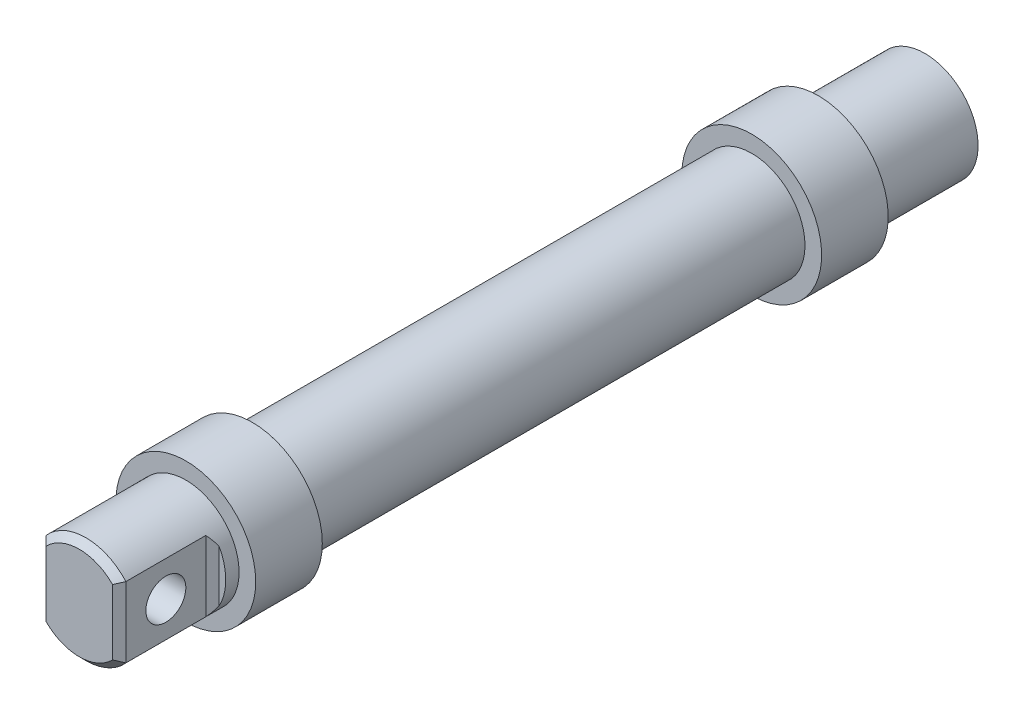
ISO-10303-21;
HEADER;
FILE_DESCRIPTION(('STEP AP214'),'2;1');
FILE_NAME('part.step','',(''),(''),'','','');
FILE_SCHEMA(('AUTOMOTIVE_DESIGN { 1 0 10303 214 1 1 1 1 }'));
ENDSEC;
DATA;
#1=APPLICATION_CONTEXT('core data for automotive mechanical design processes');
#2=APPLICATION_PROTOCOL_DEFINITION('international standard','automotive_design',2000,#1);
#3=PRODUCT_CONTEXT('',#1,'mechanical');
#4=PRODUCT('Part','Part','',(#3));
#5=PRODUCT_RELATED_PRODUCT_CATEGORY('part','',(#4));
#6=PRODUCT_DEFINITION_FORMATION('','',#4);
#7=PRODUCT_DEFINITION_CONTEXT('part definition',#1,'design');
#8=PRODUCT_DEFINITION('design','',#6,#7);
#9=PRODUCT_DEFINITION_SHAPE('','',#8);
#10=(LENGTH_UNIT() NAMED_UNIT(*) SI_UNIT(.MILLI.,.METRE.));
#11=(NAMED_UNIT(*) PLANE_ANGLE_UNIT() SI_UNIT($,.RADIAN.));
#12=(NAMED_UNIT(*) SI_UNIT($,.STERADIAN.) SOLID_ANGLE_UNIT());
#13=UNCERTAINTY_MEASURE_WITH_UNIT(LENGTH_MEASURE(1.E-05),#10,'distance_accuracy_value','');
#14=(GEOMETRIC_REPRESENTATION_CONTEXT(3) GLOBAL_UNCERTAINTY_ASSIGNED_CONTEXT((#13)) GLOBAL_UNIT_ASSIGNED_CONTEXT((#10,
#11,#12)) REPRESENTATION_CONTEXT('',''));
#15=CARTESIAN_POINT('',(0.,0.,0.));
#16=DIRECTION('',(0.,0.,1.));
#17=DIRECTION('',(1.,0.,0.));
#18=AXIS2_PLACEMENT_3D('',#15,#16,#17);
#19=CARTESIAN_POINT('',(0.,0.,-85.));
#20=DIRECTION('',(0.,0.,1.));
#21=DIRECTION('',(1.,0.,0.));
#22=AXIS2_PLACEMENT_3D('',#19,#20,#21);
#23=CYLINDRICAL_SURFACE('',#22,8.);
#24=CARTESIAN_POINT('',(0.,0.,0.));
#25=DIRECTION('',(0.,0.,1.));
#26=DIRECTION('',(1.,0.,0.));
#27=AXIS2_PLACEMENT_3D('',#24,#25,#26);
#28=CIRCLE('',#27,8.);
#29=CARTESIAN_POINT('',(8.,0.,0.));
#30=VERTEX_POINT('',#29);
#31=EDGE_CURVE('E41',#30,#30,#28,.F.);
#32=ORIENTED_EDGE('',*,*,#31,.T.);
#33=EDGE_LOOP('',(#32));
#34=FACE_BOUND('',#33,.T.);
#35=CARTESIAN_POINT('',(0.,0.,-75.));
#36=DIRECTION('',(0.,0.,-1.));
#37=DIRECTION('',(-1.,0.,0.));
#38=AXIS2_PLACEMENT_3D('',#35,#36,#37);
#39=CIRCLE('',#38,8.);
#40=CARTESIAN_POINT('',(-8.,0.,-75.));
#41=VERTEX_POINT('',#40);
#42=EDGE_CURVE('E11',#41,#41,#39,.T.);
#43=ORIENTED_EDGE('',*,*,#42,.F.);
#44=EDGE_LOOP('',(#43));
#45=FACE_BOUND('',#44,.T.);
#46=ADVANCED_FACE('F33',(#34,#45),#23,.T.);
#47=CARTESIAN_POINT('',(0.,0.,10.));
#48=DIRECTION('',(0.,0.,-1.));
#49=DIRECTION('',(-1.,0.,0.));
#50=AXIS2_PLACEMENT_3D('',#47,#48,#49);
#51=CYLINDRICAL_SURFACE('',#50,10.5);
#52=CARTESIAN_POINT('',(0.,0.,10.));
#53=DIRECTION('',(0.,0.,1.));
#54=DIRECTION('',(1.,0.,0.));
#55=AXIS2_PLACEMENT_3D('',#52,#53,#54);
#56=CIRCLE('',#55,10.5);
#57=CARTESIAN_POINT('',(10.5,0.,10.));
#58=VERTEX_POINT('',#57);
#59=EDGE_CURVE('E206',#58,#58,#56,.T.);
#60=ORIENTED_EDGE('',*,*,#59,.F.);
#61=EDGE_LOOP('',(#60));
#62=FACE_BOUND('',#61,.T.);
#63=CARTESIAN_POINT('',(0.,0.,0.));
#64=DIRECTION('',(0.,0.,1.));
#65=DIRECTION('',(1.,0.,0.));
#66=AXIS2_PLACEMENT_3D('',#63,#64,#65);
#67=CIRCLE('',#66,10.5);
#68=CARTESIAN_POINT('',(10.5,0.,0.));
#69=VERTEX_POINT('',#68);
#70=EDGE_CURVE('E204',#69,#69,#67,.T.);
#71=ORIENTED_EDGE('',*,*,#70,.T.);
#72=EDGE_LOOP('',(#71));
#73=FACE_BOUND('',#72,.T.);
#74=ADVANCED_FACE('F297',(#62,#73),#51,.T.);
#75=CARTESIAN_POINT('',(0.,0.,10.));
#76=DIRECTION('',(0.,0.,1.));
#77=DIRECTION('',(1.,0.,0.));
#78=AXIS2_PLACEMENT_3D('',#75,#76,#77);
#79=PLANE('',#78);
#80=CARTESIAN_POINT('',(0.,0.,10.));
#81=DIRECTION('',(0.,0.,1.));
#82=DIRECTION('',(1.,0.,0.));
#83=AXIS2_PLACEMENT_3D('',#80,#81,#82);
#84=CIRCLE('',#83,8.);
#85=CARTESIAN_POINT('',(8.,0.,10.));
#86=VERTEX_POINT('',#85);
#87=EDGE_CURVE('E207',#86,#86,#84,.T.);
#88=ORIENTED_EDGE('',*,*,#87,.F.);
#89=EDGE_LOOP('',(#88));
#90=FACE_BOUND('',#89,.T.);
#91=ORIENTED_EDGE('',*,*,#59,.T.);
#92=EDGE_LOOP('',(#91));
#93=FACE_BOUND('',#92,.T.);
#94=ADVANCED_FACE('F200',(#90,#93),#79,.T.);
#95=CARTESIAN_POINT('',(0.,0.,0.));
#96=DIRECTION('',(0.,0.,1.));
#97=DIRECTION('',(1.,0.,0.));
#98=AXIS2_PLACEMENT_3D('',#95,#96,#97);
#99=PLANE('',#98);
#100=ORIENTED_EDGE('',*,*,#31,.F.);
#101=EDGE_LOOP('',(#100));
#102=FACE_BOUND('',#101,.T.);
#103=ORIENTED_EDGE('',*,*,#70,.F.);
#104=EDGE_LOOP('',(#103));
#105=FACE_BOUND('',#104,.T.);
#106=ADVANCED_FACE('F196',(#102,#105),#99,.F.);
#107=CARTESIAN_POINT('',(0.,0.,26.));
#108=DIRECTION('',(0.,0.,-1.));
#109=DIRECTION('',(-1.,0.,0.));
#110=AXIS2_PLACEMENT_3D('',#107,#108,#109);
#111=CYLINDRICAL_SURFACE('',#110,8.);
#112=DIRECTION('',(0.,0.,-1.));
#113=VECTOR('',#112,1.);
#114=CARTESIAN_POINT('',(6.,-5.29150262212918,26.));
#115=LINE('',#114,#113);
#116=CARTESIAN_POINT('',(6.,-5.29150262212918,13.));
#117=VERTEX_POINT('',#116);
#118=CARTESIAN_POINT('',(6.,-5.29150262212918,25.));
#119=VERTEX_POINT('',#118);
#120=EDGE_CURVE('E184',#117,#119,#115,.F.);
#121=ORIENTED_EDGE('',*,*,#120,.T.);
#122=CARTESIAN_POINT('',(0.,0.,25.));
#123=DIRECTION('',(0.,0.,1.));
#124=DIRECTION('',(1.,0.,0.));
#125=AXIS2_PLACEMENT_3D('',#122,#123,#124);
#126=CIRCLE('',#125,8.);
#127=CARTESIAN_POINT('',(-6.,-5.29150262212918,25.));
#128=VERTEX_POINT('',#127);
#129=EDGE_CURVE('E106',#119,#128,#126,.F.);
#130=ORIENTED_EDGE('',*,*,#129,.T.);
#131=DIRECTION('',(0.,0.,-1.));
#132=VECTOR('',#131,1.);
#133=CARTESIAN_POINT('',(-6.,-5.29150262212918,26.));
#134=LINE('',#133,#132);
#135=CARTESIAN_POINT('',(-6.,-5.29150262212918,13.));
#136=VERTEX_POINT('',#135);
#137=EDGE_CURVE('E213',#128,#136,#134,.T.);
#138=ORIENTED_EDGE('',*,*,#137,.T.);
#139=CARTESIAN_POINT('',(0.,0.,18.9999999999999));
#140=DIRECTION('',(-0.707106781186544,0.,0.707106781186551));
#141=DIRECTION('',(-0.707106781186551,0.,-0.707106781186544));
#142=AXIS2_PLACEMENT_3D('',#139,#140,#141);
#143=ELLIPSE('',#142,11.3137084989847,8.);
#144=CARTESIAN_POINT('',(-7.00000000000001,-3.8729833462074,12.));
#145=VERTEX_POINT('',#144);
#146=EDGE_CURVE('E151',#136,#145,#143,.F.);
#147=ORIENTED_EDGE('',*,*,#146,.T.);
#148=CARTESIAN_POINT('',(0.,0.,12.));
#149=DIRECTION('',(0.,0.,-1.));
#150=DIRECTION('',(-1.,0.,0.));
#151=AXIS2_PLACEMENT_3D('',#148,#149,#150);
#152=CIRCLE('',#151,8.);
#153=CARTESIAN_POINT('',(-7.00000000000001,3.8729833462074,12.));
#154=VERTEX_POINT('',#153);
#155=EDGE_CURVE('E210',#145,#154,#152,.T.);
#156=ORIENTED_EDGE('',*,*,#155,.T.);
#157=CARTESIAN_POINT('',(0.,0.,18.9999999999999));
#158=DIRECTION('',(-0.707106781186544,0.,0.707106781186551));
#159=DIRECTION('',(-0.707106781186551,0.,-0.707106781186544));
#160=AXIS2_PLACEMENT_3D('',#157,#158,#159);
#161=ELLIPSE('',#160,11.3137084989847,8.);
#162=CARTESIAN_POINT('',(-6.,5.29150262212918,13.));
#163=VERTEX_POINT('',#162);
#164=EDGE_CURVE('E55',#154,#163,#161,.F.);
#165=ORIENTED_EDGE('',*,*,#164,.T.);
#166=DIRECTION('',(0.,0.,-1.));
#167=VECTOR('',#166,1.);
#168=CARTESIAN_POINT('',(-6.,5.29150262212918,26.));
#169=LINE('',#168,#167);
#170=CARTESIAN_POINT('',(-6.,5.29150262212918,25.));
#171=VERTEX_POINT('',#170);
#172=EDGE_CURVE('E228',#163,#171,#169,.F.);
#173=ORIENTED_EDGE('',*,*,#172,.T.);
#174=CARTESIAN_POINT('',(0.,0.,25.));
#175=DIRECTION('',(0.,0.,1.));
#176=DIRECTION('',(1.,0.,0.));
#177=AXIS2_PLACEMENT_3D('',#174,#175,#176);
#178=CIRCLE('',#177,8.);
#179=CARTESIAN_POINT('',(6.,5.29150262212918,25.));
#180=VERTEX_POINT('',#179);
#181=EDGE_CURVE('E126',#171,#180,#178,.F.);
#182=ORIENTED_EDGE('',*,*,#181,.T.);
#183=DIRECTION('',(0.,0.,-1.));
#184=VECTOR('',#183,1.);
#185=CARTESIAN_POINT('',(6.,5.29150262212918,26.));
#186=LINE('',#185,#184);
#187=CARTESIAN_POINT('',(6.,5.29150262212918,13.));
#188=VERTEX_POINT('',#187);
#189=EDGE_CURVE('E230',#180,#188,#186,.T.);
#190=ORIENTED_EDGE('',*,*,#189,.T.);
#191=CARTESIAN_POINT('',(0.,0.,18.9999999999999));
#192=DIRECTION('',(-0.707106781186544,0.,-0.707106781186551));
#193=DIRECTION('',(0.707106781186551,0.,-0.707106781186544));
#194=AXIS2_PLACEMENT_3D('',#191,#192,#193);
#195=ELLIPSE('',#194,11.3137084989847,8.);
#196=CARTESIAN_POINT('',(7.00000000000001,3.8729833462074,12.));
#197=VERTEX_POINT('',#196);
#198=EDGE_CURVE('E148',#188,#197,#195,.T.);
#199=ORIENTED_EDGE('',*,*,#198,.T.);
#200=CARTESIAN_POINT('',(0.,0.,12.));
#201=DIRECTION('',(0.,0.,1.));
#202=DIRECTION('',(1.,0.,0.));
#203=AXIS2_PLACEMENT_3D('',#200,#201,#202);
#204=CIRCLE('',#203,8.);
#205=CARTESIAN_POINT('',(7.00000000000001,-3.8729833462074,12.));
#206=VERTEX_POINT('',#205);
#207=EDGE_CURVE('E120',#206,#197,#204,.T.);
#208=ORIENTED_EDGE('',*,*,#207,.F.);
#209=CARTESIAN_POINT('',(0.,0.,18.9999999999999));
#210=DIRECTION('',(-0.707106781186544,0.,-0.707106781186551));
#211=DIRECTION('',(0.707106781186551,0.,-0.707106781186544));
#212=AXIS2_PLACEMENT_3D('',#209,#210,#211);
#213=ELLIPSE('',#212,11.3137084989847,8.);
#214=EDGE_CURVE('E146',#206,#117,#213,.T.);
#215=ORIENTED_EDGE('',*,*,#214,.T.);
#216=EDGE_LOOP('',(#121,#130,#138,#147,#156,#165,#173,#182,#190,#199,#208,#215));
#217=FACE_BOUND('',#216,.T.);
#218=ORIENTED_EDGE('',*,*,#87,.T.);
#219=EDGE_LOOP('',(#218));
#220=FACE_BOUND('',#219,.T.);
#221=ADVANCED_FACE('F199',(#217,#220),#111,.T.);
#222=CARTESIAN_POINT('',(0.,0.,26.));
#223=DIRECTION('',(0.,0.,1.));
#224=DIRECTION('',(1.,0.,0.));
#225=AXIS2_PLACEMENT_3D('',#222,#223,#224);
#226=PLANE('',#225);
#227=DIRECTION('',(0.,-1.,0.));
#228=VECTOR('',#227,1.);
#229=CARTESIAN_POINT('',(-5.,-5.29150262212918,26.));
#230=LINE('',#229,#228);
#231=CARTESIAN_POINT('',(-5.,4.89897948556636,26.));
#232=VERTEX_POINT('',#231);
#233=CARTESIAN_POINT('',(-5.,-4.89897948556635,26.));
#234=VERTEX_POINT('',#233);
#235=EDGE_CURVE('E124',#232,#234,#230,.T.);
#236=ORIENTED_EDGE('',*,*,#235,.T.);
#237=CARTESIAN_POINT('',(0.,0.,26.));
#238=DIRECTION('',(0.,0.,1.));
#239=DIRECTION('',(1.,0.,0.));
#240=AXIS2_PLACEMENT_3D('',#237,#238,#239);
#241=CIRCLE('',#240,7.);
#242=CARTESIAN_POINT('',(5.,-4.89897948556635,26.));
#243=VERTEX_POINT('',#242);
#244=EDGE_CURVE('E104',#234,#243,#241,.T.);
#245=ORIENTED_EDGE('',*,*,#244,.T.);
#246=DIRECTION('',(0.,1.,0.));
#247=VECTOR('',#246,1.);
#248=CARTESIAN_POINT('',(5.,5.29150262212918,26.));
#249=LINE('',#248,#247);
#250=CARTESIAN_POINT('',(5.,4.89897948556636,26.));
#251=VERTEX_POINT('',#250);
#252=EDGE_CURVE('E113',#243,#251,#249,.T.);
#253=ORIENTED_EDGE('',*,*,#252,.T.);
#254=CARTESIAN_POINT('',(0.,0.,26.));
#255=DIRECTION('',(0.,0.,1.));
#256=DIRECTION('',(1.,0.,0.));
#257=AXIS2_PLACEMENT_3D('',#254,#255,#256);
#258=CIRCLE('',#257,7.);
#259=EDGE_CURVE('E119',#251,#232,#258,.T.);
#260=ORIENTED_EDGE('',*,*,#259,.T.);
#261=EDGE_LOOP('',(#236,#245,#253,#260));
#262=FACE_BOUND('',#261,.T.);
#263=ADVANCED_FACE('F122',(#262),#226,.T.);
#264=CARTESIAN_POINT('',(0.,0.,12.));
#265=DIRECTION('',(0.,0.,-1.));
#266=DIRECTION('',(-1.,0.,0.));
#267=AXIS2_PLACEMENT_3D('',#264,#265,#266);
#268=PLANE('',#267);
#269=ORIENTED_EDGE('',*,*,#155,.F.);
#270=DIRECTION('',(0.,1.,0.));
#271=VECTOR('',#270,1.);
#272=CARTESIAN_POINT('',(-7.00000000000001,5.29150262212918,12.));
#273=LINE('',#272,#271);
#274=EDGE_CURVE('E143',#145,#154,#273,.T.);
#275=ORIENTED_EDGE('',*,*,#274,.T.);
#276=EDGE_LOOP('',(#269,#275));
#277=FACE_BOUND('',#276,.T.);
#278=ADVANCED_FACE('F312',(#277),#268,.F.);
#279=CARTESIAN_POINT('',(-6.,8.,12.));
#280=DIRECTION('',(1.,0.,0.));
#281=DIRECTION('',(0.,0.,-1.));
#282=AXIS2_PLACEMENT_3D('',#279,#280,#281);
#283=PLANE('',#282);
#284=CARTESIAN_POINT('',(-6.,0.,19.));
#285=DIRECTION('',(1.,0.,0.));
#286=DIRECTION('',(0.,0.,-1.));
#287=AXIS2_PLACEMENT_3D('',#284,#285,#286);
#288=CIRCLE('',#287,3.);
#289=CARTESIAN_POINT('',(-6.,0.,16.));
#290=VERTEX_POINT('',#289);
#291=EDGE_CURVE('E110',#290,#290,#288,.T.);
#292=ORIENTED_EDGE('',*,*,#291,.T.);
#293=EDGE_LOOP('',(#292));
#294=FACE_BOUND('',#293,.T.);
#295=ORIENTED_EDGE('',*,*,#137,.F.);
#296=DIRECTION('',(0.,1.,0.));
#297=VECTOR('',#296,1.);
#298=CARTESIAN_POINT('',(-6.,5.29150262212918,25.));
#299=LINE('',#298,#297);
#300=EDGE_CURVE('E48',#128,#171,#299,.T.);
#301=ORIENTED_EDGE('',*,*,#300,.T.);
#302=ORIENTED_EDGE('',*,*,#172,.F.);
#303=DIRECTION('',(0.,-1.,0.));
#304=VECTOR('',#303,1.);
#305=CARTESIAN_POINT('',(-6.,-5.29150262212918,13.));
#306=LINE('',#305,#304);
#307=EDGE_CURVE('E133',#163,#136,#306,.T.);
#308=ORIENTED_EDGE('',*,*,#307,.T.);
#309=EDGE_LOOP('',(#295,#301,#302,#308));
#310=FACE_BOUND('',#309,.T.);
#311=ADVANCED_FACE('F226',(#294,#310),#283,.F.);
#312=CARTESIAN_POINT('',(0.,0.,12.));
#313=DIRECTION('',(0.,0.,1.));
#314=DIRECTION('',(1.,0.,0.));
#315=AXIS2_PLACEMENT_3D('',#312,#313,#314);
#316=PLANE('',#315);
#317=ORIENTED_EDGE('',*,*,#207,.T.);
#318=DIRECTION('',(0.,-1.,0.));
#319=VECTOR('',#318,1.);
#320=CARTESIAN_POINT('',(7.00000000000001,0.,12.));
#321=LINE('',#320,#319);
#322=EDGE_CURVE('E140',#197,#206,#321,.T.);
#323=ORIENTED_EDGE('',*,*,#322,.T.);
#324=EDGE_LOOP('',(#317,#323));
#325=FACE_BOUND('',#324,.T.);
#326=ADVANCED_FACE('F304',(#325),#316,.T.);
#327=CARTESIAN_POINT('',(6.,8.,12.));
#328=DIRECTION('',(-1.,0.,0.));
#329=DIRECTION('',(0.,0.,1.));
#330=AXIS2_PLACEMENT_3D('',#327,#328,#329);
#331=PLANE('',#330);
#332=CARTESIAN_POINT('',(6.,0.,19.));
#333=DIRECTION('',(-1.,0.,0.));
#334=DIRECTION('',(0.,0.,1.));
#335=AXIS2_PLACEMENT_3D('',#332,#333,#334);
#336=CIRCLE('',#335,3.);
#337=CARTESIAN_POINT('',(6.,0.,22.));
#338=VERTEX_POINT('',#337);
#339=EDGE_CURVE('E188',#338,#338,#336,.T.);
#340=ORIENTED_EDGE('',*,*,#339,.T.);
#341=EDGE_LOOP('',(#340));
#342=FACE_BOUND('',#341,.T.);
#343=ORIENTED_EDGE('',*,*,#189,.F.);
#344=DIRECTION('',(0.,-1.,0.));
#345=VECTOR('',#344,1.);
#346=CARTESIAN_POINT('',(6.,-5.29150262212918,25.));
#347=LINE('',#346,#345);
#348=EDGE_CURVE('E138',#180,#119,#347,.T.);
#349=ORIENTED_EDGE('',*,*,#348,.T.);
#350=ORIENTED_EDGE('',*,*,#120,.F.);
#351=DIRECTION('',(0.,1.,0.));
#352=VECTOR('',#351,1.);
#353=CARTESIAN_POINT('',(6.,8.,13.));
#354=LINE('',#353,#352);
#355=EDGE_CURVE('E136',#117,#188,#354,.T.);
#356=ORIENTED_EDGE('',*,*,#355,.T.);
#357=EDGE_LOOP('',(#343,#349,#350,#356));
#358=FACE_BOUND('',#357,.T.);
#359=ADVANCED_FACE('F307',(#342,#358),#331,.F.);
#360=CARTESIAN_POINT('',(0.,0.,26.));
#361=DIRECTION('',(0.,0.,-1.));
#362=DIRECTION('',(-1.,0.,0.));
#363=AXIS2_PLACEMENT_3D('',#360,#361,#362);
#364=CONICAL_SURFACE('',#363,7.,0.78539816339745);
#365=CARTESIAN_POINT('',(6.,5.29150262212918,25.));
#366=CARTESIAN_POINT('',(5.91644673933473,5.25992203516245,25.0835532606653));
#367=CARTESIAN_POINT('',(5.83294309832325,5.22807833382434,25.1670569016768));
#368=CARTESIAN_POINT('',(5.66604466884653,5.16383689599456,25.3339553311535));
#369=CARTESIAN_POINT('',(5.5826498777513,5.13143917316608,25.4173501222487));
#370=CARTESIAN_POINT('',(5.41597431671878,5.06606020441487,25.5840256832812));
#371=CARTESIAN_POINT('',(5.33269354723245,5.03307895619143,25.6673064527676));
#372=CARTESIAN_POINT('',(5.16625316998148,4.966499722158,25.8337468300185));
#373=CARTESIAN_POINT('',(5.08309356525168,4.93290172117729,25.9169064347483));
#374=CARTESIAN_POINT('',(4.99999999999999,4.89897948556635,26.));
#375=B_SPLINE_CURVE_WITH_KNOTS('',3,(#365,#366,#367,#368,#369,#370,#371,#372,#373,#374),
.UNSPECIFIED.,.F.,.F.,(4,2,2,2,4),(0.,0.366928579326867,0.733848122534202,1.10076911274762,
1.4676991405062),.UNSPECIFIED.);
#376=EDGE_CURVE('E116',#180,#251,#375,.T.);
#377=ORIENTED_EDGE('',*,*,#376,.F.);
#378=ORIENTED_EDGE('',*,*,#181,.F.);
#379=CARTESIAN_POINT('',(-6.,5.29150262212918,25.));
#380=CARTESIAN_POINT('',(-5.91644673933473,5.25992203516245,25.0835532606653));
#381=CARTESIAN_POINT('',(-5.83294309832325,5.22807833382434,25.1670569016768));
#382=CARTESIAN_POINT('',(-5.66604466884653,5.16383689599456,25.3339553311535));
#383=CARTESIAN_POINT('',(-5.5826498777513,5.13143917316608,25.4173501222487));
#384=CARTESIAN_POINT('',(-5.41597431671878,5.06606020441487,25.5840256832812));
#385=CARTESIAN_POINT('',(-5.33269354723245,5.03307895619143,25.6673064527676));
#386=CARTESIAN_POINT('',(-5.16625316998148,4.966499722158,25.8337468300185));
#387=CARTESIAN_POINT('',(-5.08309356525168,4.93290172117729,25.9169064347483));
#388=CARTESIAN_POINT('',(-4.99999999999999,4.89897948556635,26.));
#389=B_SPLINE_CURVE_WITH_KNOTS('',3,(#379,#380,#381,#382,#383,#384,#385,#386,#387,#388),
.UNSPECIFIED.,.F.,.F.,(4,2,2,2,4),(0.,0.366928579326867,0.733848122534202,1.10076911274762,
1.4676991405062),.UNSPECIFIED.);
#390=EDGE_CURVE('E178',#232,#171,#389,.F.);
#391=ORIENTED_EDGE('',*,*,#390,.F.);
#392=ORIENTED_EDGE('',*,*,#259,.F.);
#393=EDGE_LOOP('',(#377,#378,#391,#392));
#394=FACE_BOUND('',#393,.T.);
#395=ADVANCED_FACE('F173',(#394),#364,.T.);
#396=CARTESIAN_POINT('',(-6.,8.,25.));
#397=DIRECTION('',(-0.707106781186546,0.,0.707106781186549));
#398=DIRECTION('',(0.,-1.,0.));
#399=AXIS2_PLACEMENT_3D('',#396,#397,#398);
#400=PLANE('',#399);
#401=ORIENTED_EDGE('',*,*,#390,.T.);
#402=ORIENTED_EDGE('',*,*,#300,.F.);
#403=CARTESIAN_POINT('',(-6.,-5.29150262212918,25.));
#404=CARTESIAN_POINT('',(-5.91644673933473,-5.25992203516245,25.0835532606653));
#405=CARTESIAN_POINT('',(-5.83294309832325,-5.22807833382434,25.1670569016768));
#406=CARTESIAN_POINT('',(-5.66604466884653,-5.16383689599456,25.3339553311535));
#407=CARTESIAN_POINT('',(-5.5826498777513,-5.13143917316608,25.4173501222487));
#408=CARTESIAN_POINT('',(-5.41597431671878,-5.06606020441487,25.5840256832812));
#409=CARTESIAN_POINT('',(-5.33269354723245,-5.03307895619143,25.6673064527675));
#410=CARTESIAN_POINT('',(-5.16625316998148,-4.966499722158,25.8337468300185));
#411=CARTESIAN_POINT('',(-5.08309356525168,-4.93290172117729,25.9169064347483));
#412=CARTESIAN_POINT('',(-4.99999999999999,-4.89897948556635,26.));
#413=B_SPLINE_CURVE_WITH_KNOTS('',3,(#403,#404,#405,#406,#407,#408,#409,#410,#411,#412),
.UNSPECIFIED.,.F.,.F.,(4,2,2,2,4),(0.,0.366928579326867,0.733848122534202,1.10076911274762,
1.4676991405062),.UNSPECIFIED.);
#414=EDGE_CURVE('E109',#234,#128,#413,.F.);
#415=ORIENTED_EDGE('',*,*,#414,.F.);
#416=ORIENTED_EDGE('',*,*,#235,.F.);
#417=EDGE_LOOP('',(#401,#402,#415,#416));
#418=FACE_BOUND('',#417,.T.);
#419=ADVANCED_FACE('F168',(#418),#400,.T.);
#420=CARTESIAN_POINT('',(6.,8.,25.));
#421=DIRECTION('',(0.707106781186546,0.,0.707106781186549));
#422=DIRECTION('',(0.,1.,0.));
#423=AXIS2_PLACEMENT_3D('',#420,#421,#422);
#424=PLANE('',#423);
#425=ORIENTED_EDGE('',*,*,#376,.T.);
#426=ORIENTED_EDGE('',*,*,#252,.F.);
#427=CARTESIAN_POINT('',(5.,-4.89897948556635,26.));
#428=CARTESIAN_POINT('',(5.08309356525168,-4.93290172117729,25.9169064347483));
#429=CARTESIAN_POINT('',(5.16625316998149,-4.966499722158,25.8337468300185));
#430=CARTESIAN_POINT('',(5.33269354723245,-5.03307895619143,25.6673064527676));
#431=CARTESIAN_POINT('',(5.41597431671878,-5.06606020441487,25.5840256832812));
#432=CARTESIAN_POINT('',(5.5826498777513,-5.13143917316608,25.4173501222487));
#433=CARTESIAN_POINT('',(5.66604466884653,-5.16383689599456,25.3339553311535));
#434=CARTESIAN_POINT('',(5.83294309832325,-5.22807833382434,25.1670569016768));
#435=CARTESIAN_POINT('',(5.91644673933473,-5.25992203516245,25.0835532606653));
#436=CARTESIAN_POINT('',(6.,-5.29150262212918,25.));
#437=B_SPLINE_CURVE_WITH_KNOTS('',3,(#427,#428,#429,#430,#431,#432,#433,#434,#435,#436),
.UNSPECIFIED.,.F.,.F.,(4,2,2,2,4),(0.,0.366930027758575,0.733851017971996,1.10077056117933,
1.4676991405062),.UNSPECIFIED.);
#438=EDGE_CURVE('E100',#119,#243,#437,.F.);
#439=ORIENTED_EDGE('',*,*,#438,.F.);
#440=ORIENTED_EDGE('',*,*,#348,.F.);
#441=EDGE_LOOP('',(#425,#426,#439,#440));
#442=FACE_BOUND('',#441,.T.);
#443=ADVANCED_FACE('F114',(#442),#424,.T.);
#444=CARTESIAN_POINT('',(0.,0.,26.));
#445=DIRECTION('',(0.,0.,-1.));
#446=DIRECTION('',(-1.,0.,0.));
#447=AXIS2_PLACEMENT_3D('',#444,#445,#446);
#448=CONICAL_SURFACE('',#447,7.,0.78539816339745);
#449=ORIENTED_EDGE('',*,*,#414,.T.);
#450=ORIENTED_EDGE('',*,*,#129,.F.);
#451=ORIENTED_EDGE('',*,*,#438,.T.);
#452=ORIENTED_EDGE('',*,*,#244,.F.);
#453=EDGE_LOOP('',(#449,#450,#451,#452));
#454=FACE_BOUND('',#453,.T.);
#455=ADVANCED_FACE('F102',(#454),#448,.T.);
#456=CARTESIAN_POINT('',(7.00000000000001,0.,12.));
#457=DIRECTION('',(-0.707106781186544,0.,-0.707106781186551));
#458=DIRECTION('',(0.,-1.,0.));
#459=AXIS2_PLACEMENT_3D('',#456,#457,#458);
#460=PLANE('',#459);
#461=ORIENTED_EDGE('',*,*,#198,.F.);
#462=ORIENTED_EDGE('',*,*,#355,.F.);
#463=ORIENTED_EDGE('',*,*,#214,.F.);
#464=ORIENTED_EDGE('',*,*,#322,.F.);
#465=EDGE_LOOP('',(#461,#462,#463,#464));
#466=FACE_BOUND('',#465,.T.);
#467=ADVANCED_FACE('F167',(#466),#460,.F.);
#468=CARTESIAN_POINT('',(-7.00000000000001,0.,12.));
#469=DIRECTION('',(-0.707106781186544,0.,0.707106781186551));
#470=DIRECTION('',(0.,-1.,0.));
#471=AXIS2_PLACEMENT_3D('',#468,#469,#470);
#472=PLANE('',#471);
#473=ORIENTED_EDGE('',*,*,#146,.F.);
#474=ORIENTED_EDGE('',*,*,#307,.F.);
#475=ORIENTED_EDGE('',*,*,#164,.F.);
#476=ORIENTED_EDGE('',*,*,#274,.F.);
#477=EDGE_LOOP('',(#473,#474,#475,#476));
#478=FACE_BOUND('',#477,.T.);
#479=ADVANCED_FACE('F35',(#478),#472,.T.);
#480=CARTESIAN_POINT('',(10.5,0.,19.));
#481=DIRECTION('',(-1.,0.,0.));
#482=DIRECTION('',(0.,0.,1.));
#483=AXIS2_PLACEMENT_3D('',#480,#481,#482);
#484=CYLINDRICAL_SURFACE('',#483,3.);
#485=ORIENTED_EDGE('',*,*,#339,.F.);
#486=EDGE_LOOP('',(#485));
#487=FACE_BOUND('',#486,.T.);
#488=ORIENTED_EDGE('',*,*,#291,.F.);
#489=EDGE_LOOP('',(#488));
#490=FACE_BOUND('',#489,.T.);
#491=ADVANCED_FACE('F285',(#487,#490),#484,.F.);
#492=CARTESIAN_POINT('',(0.,0.,-75.));
#493=DIRECTION('',(0.,0.,-1.));
#494=DIRECTION('',(-1.,0.,0.));
#495=AXIS2_PLACEMENT_3D('',#492,#493,#494);
#496=CYLINDRICAL_SURFACE('',#495,10.5);
#497=CARTESIAN_POINT('',(0.,0.,-75.));
#498=DIRECTION('',(0.,0.,-1.));
#499=DIRECTION('',(-1.,0.,0.));
#500=AXIS2_PLACEMENT_3D('',#497,#498,#499);
#501=CIRCLE('',#500,10.5);
#502=CARTESIAN_POINT('',(-10.5,0.,-75.));
#503=VERTEX_POINT('',#502);
#504=EDGE_CURVE('E190',#503,#503,#501,.T.);
#505=ORIENTED_EDGE('',*,*,#504,.T.);
#506=EDGE_LOOP('',(#505));
#507=FACE_BOUND('',#506,.T.);
#508=CARTESIAN_POINT('',(0.,0.,-85.));
#509=DIRECTION('',(0.,0.,-1.));
#510=DIRECTION('',(-1.,0.,0.));
#511=AXIS2_PLACEMENT_3D('',#508,#509,#510);
#512=CIRCLE('',#511,10.5);
#513=CARTESIAN_POINT('',(-10.5,0.,-85.));
#514=VERTEX_POINT('',#513);
#515=EDGE_CURVE('E238',#514,#514,#512,.T.);
#516=ORIENTED_EDGE('',*,*,#515,.F.);
#517=EDGE_LOOP('',(#516));
#518=FACE_BOUND('',#517,.T.);
#519=ADVANCED_FACE('F283',(#507,#518),#496,.T.);
#520=CARTESIAN_POINT('',(0.,0.,-75.));
#521=DIRECTION('',(0.,0.,-1.));
#522=DIRECTION('',(-1.,0.,0.));
#523=AXIS2_PLACEMENT_3D('',#520,#521,#522);
#524=PLANE('',#523);
#525=ORIENTED_EDGE('',*,*,#42,.T.);
#526=EDGE_LOOP('',(#525));
#527=FACE_BOUND('',#526,.T.);
#528=ORIENTED_EDGE('',*,*,#504,.F.);
#529=EDGE_LOOP('',(#528));
#530=FACE_BOUND('',#529,.T.);
#531=ADVANCED_FACE('F279',(#527,#530),#524,.F.);
#532=CARTESIAN_POINT('',(0.,0.,-85.));
#533=DIRECTION('',(0.,0.,-1.));
#534=DIRECTION('',(-1.,0.,0.));
#535=AXIS2_PLACEMENT_3D('',#532,#533,#534);
#536=PLANE('',#535);
#537=CARTESIAN_POINT('',(0.,0.,-85.));
#538=DIRECTION('',(0.,0.,-1.));
#539=DIRECTION('',(-1.,0.,0.));
#540=AXIS2_PLACEMENT_3D('',#537,#538,#539);
#541=CIRCLE('',#540,8.);
#542=CARTESIAN_POINT('',(-8.,0.,-85.));
#543=VERTEX_POINT('',#542);
#544=EDGE_CURVE('E244',#543,#543,#541,.T.);
#545=ORIENTED_EDGE('',*,*,#544,.F.);
#546=EDGE_LOOP('',(#545));
#547=FACE_BOUND('',#546,.T.);
#548=ORIENTED_EDGE('',*,*,#515,.T.);
#549=EDGE_LOOP('',(#548));
#550=FACE_BOUND('',#549,.T.);
#551=ADVANCED_FACE('F273',(#547,#550),#536,.T.);
#552=CARTESIAN_POINT('',(0.,0.,-101.));
#553=DIRECTION('',(0.,0.,1.));
#554=DIRECTION('',(1.,0.,0.));
#555=AXIS2_PLACEMENT_3D('',#552,#553,#554);
#556=CYLINDRICAL_SURFACE('',#555,8.);
#557=CARTESIAN_POINT('',(0.,0.,-101.));
#558=DIRECTION('',(0.,0.,-1.));
#559=DIRECTION('',(-1.,0.,0.));
#560=AXIS2_PLACEMENT_3D('',#557,#558,#559);
#561=CIRCLE('',#560,8.);
#562=CARTESIAN_POINT('',(-8.,0.,-101.));
#563=VERTEX_POINT('',#562);
#564=EDGE_CURVE('E241',#563,#563,#561,.T.);
#565=ORIENTED_EDGE('',*,*,#564,.F.);
#566=EDGE_LOOP('',(#565));
#567=FACE_BOUND('',#566,.T.);
#568=ORIENTED_EDGE('',*,*,#544,.T.);
#569=EDGE_LOOP('',(#568));
#570=FACE_BOUND('',#569,.T.);
#571=ADVANCED_FACE('F267',(#567,#570),#556,.T.);
#572=CARTESIAN_POINT('',(0.,0.,-101.));
#573=DIRECTION('',(0.,0.,-1.));
#574=DIRECTION('',(-1.,0.,0.));
#575=AXIS2_PLACEMENT_3D('',#572,#573,#574);
#576=PLANE('',#575);
#577=CARTESIAN_POINT('',(0.,0.,-101.));
#578=DIRECTION('',(0.,0.,-1.));
#579=DIRECTION('',(-1.,0.,0.));
#580=AXIS2_PLACEMENT_3D('',#577,#578,#579);
#581=CIRCLE('',#580,3.);
#582=CARTESIAN_POINT('',(-3.,0.,-101.));
#583=VERTEX_POINT('',#582);
#584=EDGE_CURVE('E250',#583,#583,#581,.T.);
#585=ORIENTED_EDGE('',*,*,#584,.F.);
#586=EDGE_LOOP('',(#585));
#587=FACE_BOUND('',#586,.T.);
#588=ORIENTED_EDGE('',*,*,#564,.T.);
#589=EDGE_LOOP('',(#588));
#590=FACE_BOUND('',#589,.T.);
#591=ADVANCED_FACE('F261',(#587,#590),#576,.T.);
#592=CARTESIAN_POINT('',(0.,0.,-3.));
#593=DIRECTION('',(0.,0.,-1.));
#594=DIRECTION('',(-1.,0.,0.));
#595=AXIS2_PLACEMENT_3D('',#592,#593,#594);
#596=CYLINDRICAL_SURFACE('',#595,3.);
#597=CARTESIAN_POINT('',(0.,0.,-3.));
#598=DIRECTION('',(0.,0.,-1.));
#599=DIRECTION('',(-1.,0.,0.));
#600=AXIS2_PLACEMENT_3D('',#597,#598,#599);
#601=CIRCLE('',#600,3.);
#602=CARTESIAN_POINT('',(-3.,0.,-3.));
#603=VERTEX_POINT('',#602);
#604=EDGE_CURVE('E247',#603,#603,#601,.T.);
#605=ORIENTED_EDGE('',*,*,#604,.F.);
#606=EDGE_LOOP('',(#605));
#607=FACE_BOUND('',#606,.T.);
#608=ORIENTED_EDGE('',*,*,#584,.T.);
#609=EDGE_LOOP('',(#608));
#610=FACE_BOUND('',#609,.T.);
#611=ADVANCED_FACE('F258',(#607,#610),#596,.F.);
#612=CARTESIAN_POINT('',(0.,0.,-3.));
#613=DIRECTION('',(0.,0.,-1.));
#614=DIRECTION('',(-1.,0.,0.));
#615=AXIS2_PLACEMENT_3D('',#612,#613,#614);
#616=PLANE('',#615);
#617=ORIENTED_EDGE('',*,*,#604,.T.);
#618=EDGE_LOOP('',(#617));
#619=FACE_BOUND('',#618,.T.);
#620=ADVANCED_FACE('F256',(#619),#616,.T.);
#621=CLOSED_SHELL('',(#46,#74,#94,#106,#221,#263,#278,#311,#326,#359,#395,#419,#443,#455,#467,
#479,#491,#519,#531,#551,#571,#591,#611,#620));
#622=MANIFOLD_SOLID_BREP('B2',#621);
#623=ADVANCED_BREP_SHAPE_REPRESENTATION('',(#18,#622),#14);
#624=SHAPE_DEFINITION_REPRESENTATION(#9,#623);
ENDSEC;
END-ISO-10303-21;
